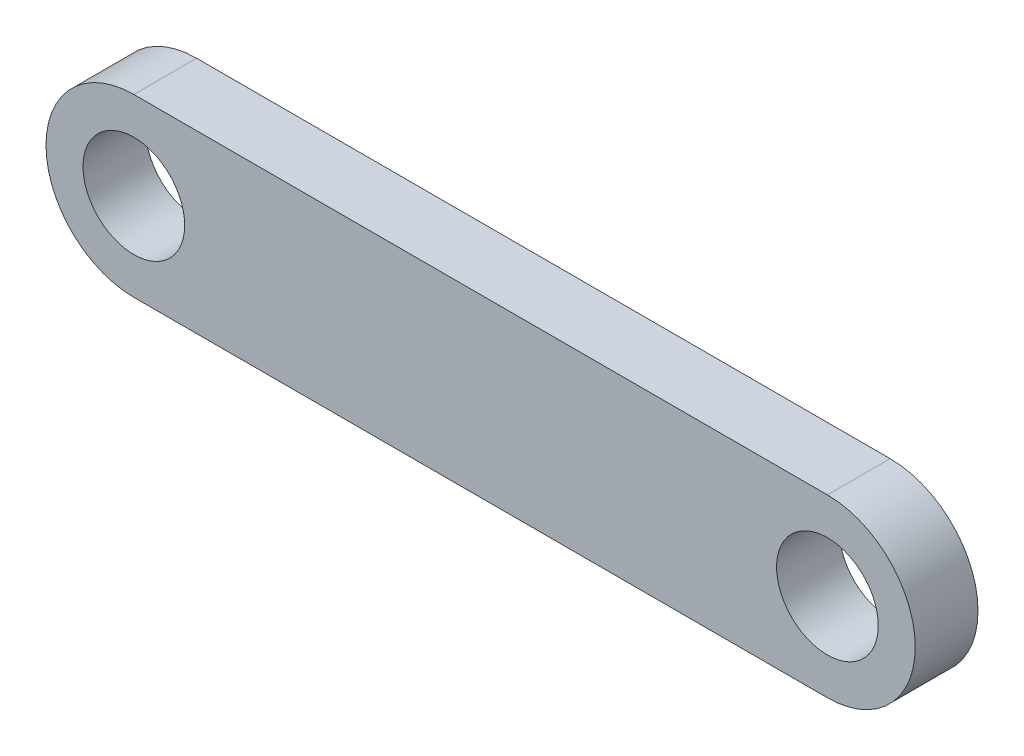
ISO-10303-21;
HEADER;
FILE_DESCRIPTION(('STEP AP214'),'2;1');
FILE_NAME('part.step','',(''),(''),'','','');
FILE_SCHEMA(('AUTOMOTIVE_DESIGN { 1 0 10303 214 1 1 1 1 }'));
ENDSEC;
DATA;
#1=APPLICATION_CONTEXT('core data for automotive mechanical design processes');
#2=APPLICATION_PROTOCOL_DEFINITION('international standard','automotive_design',2000,#1);
#3=PRODUCT_CONTEXT('',#1,'mechanical');
#4=PRODUCT('Part','Part','',(#3));
#5=PRODUCT_RELATED_PRODUCT_CATEGORY('part','',(#4));
#6=PRODUCT_DEFINITION_FORMATION('','',#4);
#7=PRODUCT_DEFINITION_CONTEXT('part definition',#1,'design');
#8=PRODUCT_DEFINITION('design','',#6,#7);
#9=PRODUCT_DEFINITION_SHAPE('','',#8);
#10=(LENGTH_UNIT() NAMED_UNIT(*) SI_UNIT(.MILLI.,.METRE.));
#11=(NAMED_UNIT(*) PLANE_ANGLE_UNIT() SI_UNIT($,.RADIAN.));
#12=(NAMED_UNIT(*) SI_UNIT($,.STERADIAN.) SOLID_ANGLE_UNIT());
#13=UNCERTAINTY_MEASURE_WITH_UNIT(LENGTH_MEASURE(1.E-05),#10,'distance_accuracy_value','');
#14=(GEOMETRIC_REPRESENTATION_CONTEXT(3) GLOBAL_UNCERTAINTY_ASSIGNED_CONTEXT((#13)) GLOBAL_UNIT_ASSIGNED_CONTEXT((#10,
#11,#12)) REPRESENTATION_CONTEXT('',''));
#15=CARTESIAN_POINT('',(0.,0.,0.));
#16=DIRECTION('',(0.,0.,1.));
#17=DIRECTION('',(1.,0.,0.));
#18=AXIS2_PLACEMENT_3D('',#15,#16,#17);
#19=CARTESIAN_POINT('',(0.,-7.,5.));
#20=DIRECTION('',(0.,1.,0.));
#21=DIRECTION('',(0.,0.,1.));
#22=AXIS2_PLACEMENT_3D('',#19,#20,#21);
#23=PLANE('',#22);
#24=DIRECTION('',(1.,0.,0.));
#25=VECTOR('',#24,1.);
#26=CARTESIAN_POINT('',(0.,-7.,0.));
#27=LINE('',#26,#25);
#28=CARTESIAN_POINT('',(0.,-7.,0.));
#29=VERTEX_POINT('',#28);
#30=CARTESIAN_POINT('',(55.26,-7.,0.));
#31=VERTEX_POINT('',#30);
#32=EDGE_CURVE('E106',#29,#31,#27,.T.);
#33=ORIENTED_EDGE('',*,*,#32,.T.);
#34=DIRECTION('',(0.,0.,-1.));
#35=VECTOR('',#34,1.);
#36=CARTESIAN_POINT('',(55.26,-7.,5.));
#37=LINE('',#36,#35);
#38=CARTESIAN_POINT('',(55.26,-7.,5.));
#39=VERTEX_POINT('',#38);
#40=EDGE_CURVE('E11',#39,#31,#37,.T.);
#41=ORIENTED_EDGE('',*,*,#40,.F.);
#42=DIRECTION('',(1.,0.,0.));
#43=VECTOR('',#42,1.);
#44=CARTESIAN_POINT('',(0.,-7.,5.));
#45=LINE('',#44,#43);
#46=CARTESIAN_POINT('',(0.,-7.,5.));
#47=VERTEX_POINT('',#46);
#48=EDGE_CURVE('E85',#47,#39,#45,.T.);
#49=ORIENTED_EDGE('',*,*,#48,.F.);
#50=DIRECTION('',(0.,0.,-1.));
#51=VECTOR('',#50,1.);
#52=CARTESIAN_POINT('',(0.,-7.,5.));
#53=LINE('',#52,#51);
#54=EDGE_CURVE('E102',#47,#29,#53,.T.);
#55=ORIENTED_EDGE('',*,*,#54,.T.);
#56=EDGE_LOOP('',(#33,#41,#49,#55));
#57=FACE_BOUND('',#56,.T.);
#58=ADVANCED_FACE('F36',(#57),#23,.F.);
#59=CARTESIAN_POINT('',(55.26,0.,5.));
#60=DIRECTION('',(0.,0.,-1.));
#61=DIRECTION('',(-1.,0.,0.));
#62=AXIS2_PLACEMENT_3D('',#59,#60,#61);
#63=CYLINDRICAL_SURFACE('',#62,7.);
#64=CARTESIAN_POINT('',(55.26,0.,0.));
#65=DIRECTION('',(0.,0.,1.));
#66=DIRECTION('',(1.,0.,0.));
#67=AXIS2_PLACEMENT_3D('',#64,#65,#66);
#68=CIRCLE('',#67,7.);
#69=CARTESIAN_POINT('',(55.26,7.,0.));
#70=VERTEX_POINT('',#69);
#71=EDGE_CURVE('E90',#31,#70,#68,.T.);
#72=ORIENTED_EDGE('',*,*,#71,.T.);
#73=DIRECTION('',(0.,0.,-1.));
#74=VECTOR('',#73,1.);
#75=CARTESIAN_POINT('',(55.26,7.,5.));
#76=LINE('',#75,#74);
#77=CARTESIAN_POINT('',(55.26,7.,5.));
#78=VERTEX_POINT('',#77);
#79=EDGE_CURVE('E45',#78,#70,#76,.T.);
#80=ORIENTED_EDGE('',*,*,#79,.F.);
#81=CARTESIAN_POINT('',(55.26,0.,5.));
#82=DIRECTION('',(0.,0.,1.));
#83=DIRECTION('',(1.,0.,0.));
#84=AXIS2_PLACEMENT_3D('',#81,#82,#83);
#85=CIRCLE('',#84,7.);
#86=EDGE_CURVE('E79',#39,#78,#85,.T.);
#87=ORIENTED_EDGE('',*,*,#86,.F.);
#88=ORIENTED_EDGE('',*,*,#40,.T.);
#89=EDGE_LOOP('',(#72,#80,#87,#88));
#90=FACE_BOUND('',#89,.T.);
#91=ADVANCED_FACE('F89',(#90),#63,.T.);
#92=CARTESIAN_POINT('',(0.,7.,5.));
#93=DIRECTION('',(0.,1.,0.));
#94=DIRECTION('',(0.,0.,1.));
#95=AXIS2_PLACEMENT_3D('',#92,#93,#94);
#96=PLANE('',#95);
#97=DIRECTION('',(1.,0.,0.));
#98=VECTOR('',#97,1.);
#99=CARTESIAN_POINT('',(0.,7.,0.));
#100=LINE('',#99,#98);
#101=CARTESIAN_POINT('',(0.,7.,0.));
#102=VERTEX_POINT('',#101);
#103=EDGE_CURVE('E110',#102,#70,#100,.T.);
#104=ORIENTED_EDGE('',*,*,#103,.F.);
#105=DIRECTION('',(0.,0.,-1.));
#106=VECTOR('',#105,1.);
#107=CARTESIAN_POINT('',(0.,7.,5.));
#108=LINE('',#107,#106);
#109=CARTESIAN_POINT('',(0.,7.,5.));
#110=VERTEX_POINT('',#109);
#111=EDGE_CURVE('E69',#110,#102,#108,.T.);
#112=ORIENTED_EDGE('',*,*,#111,.F.);
#113=DIRECTION('',(1.,0.,0.));
#114=VECTOR('',#113,1.);
#115=CARTESIAN_POINT('',(0.,7.,5.));
#116=LINE('',#115,#114);
#117=EDGE_CURVE('E83',#110,#78,#116,.T.);
#118=ORIENTED_EDGE('',*,*,#117,.T.);
#119=ORIENTED_EDGE('',*,*,#79,.T.);
#120=EDGE_LOOP('',(#104,#112,#118,#119));
#121=FACE_BOUND('',#120,.T.);
#122=ADVANCED_FACE('F94',(#121),#96,.T.);
#123=CARTESIAN_POINT('',(0.,0.,5.));
#124=DIRECTION('',(0.,0.,-1.));
#125=DIRECTION('',(-1.,0.,0.));
#126=AXIS2_PLACEMENT_3D('',#123,#124,#125);
#127=CYLINDRICAL_SURFACE('',#126,7.);
#128=CARTESIAN_POINT('',(0.,0.,0.));
#129=DIRECTION('',(0.,0.,1.));
#130=DIRECTION('',(1.,0.,0.));
#131=AXIS2_PLACEMENT_3D('',#128,#129,#130);
#132=CIRCLE('',#131,7.);
#133=EDGE_CURVE('E72',#102,#29,#132,.T.);
#134=ORIENTED_EDGE('',*,*,#133,.T.);
#135=ORIENTED_EDGE('',*,*,#54,.F.);
#136=CARTESIAN_POINT('',(0.,0.,5.));
#137=DIRECTION('',(0.,0.,1.));
#138=DIRECTION('',(1.,0.,0.));
#139=AXIS2_PLACEMENT_3D('',#136,#137,#138);
#140=CIRCLE('',#139,7.);
#141=EDGE_CURVE('E53',#110,#47,#140,.T.);
#142=ORIENTED_EDGE('',*,*,#141,.F.);
#143=ORIENTED_EDGE('',*,*,#111,.T.);
#144=EDGE_LOOP('',(#134,#135,#142,#143));
#145=FACE_BOUND('',#144,.T.);
#146=ADVANCED_FACE('F138',(#145),#127,.T.);
#147=CARTESIAN_POINT('',(0.,0.,5.));
#148=DIRECTION('',(0.,0.,-1.));
#149=DIRECTION('',(-1.,0.,0.));
#150=AXIS2_PLACEMENT_3D('',#147,#148,#149);
#151=CYLINDRICAL_SURFACE('',#150,4.05);
#152=CARTESIAN_POINT('',(0.,0.,5.));
#153=DIRECTION('',(0.,0.,1.));
#154=DIRECTION('',(1.,0.,0.));
#155=AXIS2_PLACEMENT_3D('',#152,#153,#154);
#156=CIRCLE('',#155,4.05);
#157=CARTESIAN_POINT('',(4.05,0.,5.));
#158=VERTEX_POINT('',#157);
#159=EDGE_CURVE('E116',#158,#158,#156,.T.);
#160=ORIENTED_EDGE('',*,*,#159,.T.);
#161=EDGE_LOOP('',(#160));
#162=FACE_BOUND('',#161,.T.);
#163=CARTESIAN_POINT('',(0.,0.,0.));
#164=DIRECTION('',(0.,0.,1.));
#165=DIRECTION('',(1.,0.,0.));
#166=AXIS2_PLACEMENT_3D('',#163,#164,#165);
#167=CIRCLE('',#166,4.05);
#168=CARTESIAN_POINT('',(4.05,0.,0.));
#169=VERTEX_POINT('',#168);
#170=EDGE_CURVE('E103',#169,#169,#167,.T.);
#171=ORIENTED_EDGE('',*,*,#170,.F.);
#172=EDGE_LOOP('',(#171));
#173=FACE_BOUND('',#172,.T.);
#174=ADVANCED_FACE('F38',(#162,#173),#151,.F.);
#175=CARTESIAN_POINT('',(55.26,0.,5.));
#176=DIRECTION('',(0.,0.,-1.));
#177=DIRECTION('',(-1.,0.,0.));
#178=AXIS2_PLACEMENT_3D('',#175,#176,#177);
#179=CYLINDRICAL_SURFACE('',#178,4.05);
#180=CARTESIAN_POINT('',(55.26,0.,5.));
#181=DIRECTION('',(0.,0.,1.));
#182=DIRECTION('',(1.,0.,0.));
#183=AXIS2_PLACEMENT_3D('',#180,#181,#182);
#184=CIRCLE('',#183,4.05);
#185=CARTESIAN_POINT('',(59.31,0.,5.));
#186=VERTEX_POINT('',#185);
#187=EDGE_CURVE('E96',#186,#186,#184,.T.);
#188=ORIENTED_EDGE('',*,*,#187,.T.);
#189=EDGE_LOOP('',(#188));
#190=FACE_BOUND('',#189,.T.);
#191=CARTESIAN_POINT('',(55.26,0.,0.));
#192=DIRECTION('',(0.,0.,1.));
#193=DIRECTION('',(1.,0.,0.));
#194=AXIS2_PLACEMENT_3D('',#191,#192,#193);
#195=CIRCLE('',#194,4.05);
#196=CARTESIAN_POINT('',(59.31,0.,0.));
#197=VERTEX_POINT('',#196);
#198=EDGE_CURVE('E113',#197,#197,#195,.T.);
#199=ORIENTED_EDGE('',*,*,#198,.F.);
#200=EDGE_LOOP('',(#199));
#201=FACE_BOUND('',#200,.T.);
#202=ADVANCED_FACE('F128',(#190,#201),#179,.F.);
#203=CARTESIAN_POINT('',(0.,0.,5.));
#204=DIRECTION('',(0.,0.,1.));
#205=DIRECTION('',(1.,0.,0.));
#206=AXIS2_PLACEMENT_3D('',#203,#204,#205);
#207=PLANE('',#206);
#208=ORIENTED_EDGE('',*,*,#159,.F.);
#209=EDGE_LOOP('',(#208));
#210=FACE_BOUND('',#209,.T.);
#211=ORIENTED_EDGE('',*,*,#48,.T.);
#212=ORIENTED_EDGE('',*,*,#86,.T.);
#213=ORIENTED_EDGE('',*,*,#117,.F.);
#214=ORIENTED_EDGE('',*,*,#141,.T.);
#215=EDGE_LOOP('',(#211,#212,#213,#214));
#216=FACE_BOUND('',#215,.T.);
#217=ORIENTED_EDGE('',*,*,#187,.F.);
#218=EDGE_LOOP('',(#217));
#219=FACE_BOUND('',#218,.T.);
#220=ADVANCED_FACE('F80',(#210,#216,#219),#207,.T.);
#221=CARTESIAN_POINT('',(0.,0.,0.));
#222=DIRECTION('',(0.,0.,1.));
#223=DIRECTION('',(1.,0.,0.));
#224=AXIS2_PLACEMENT_3D('',#221,#222,#223);
#225=PLANE('',#224);
#226=ORIENTED_EDGE('',*,*,#170,.T.);
#227=EDGE_LOOP('',(#226));
#228=FACE_BOUND('',#227,.T.);
#229=ORIENTED_EDGE('',*,*,#32,.F.);
#230=ORIENTED_EDGE('',*,*,#133,.F.);
#231=ORIENTED_EDGE('',*,*,#103,.T.);
#232=ORIENTED_EDGE('',*,*,#71,.F.);
#233=EDGE_LOOP('',(#229,#230,#231,#232));
#234=FACE_BOUND('',#233,.T.);
#235=ORIENTED_EDGE('',*,*,#198,.T.);
#236=EDGE_LOOP('',(#235));
#237=FACE_BOUND('',#236,.T.);
#238=ADVANCED_FACE('F121',(#228,#234,#237),#225,.F.);
#239=CLOSED_SHELL('',(#58,#91,#122,#146,#174,#202,#220,#238));
#240=MANIFOLD_SOLID_BREP('B2',#239);
#241=ADVANCED_BREP_SHAPE_REPRESENTATION('',(#18,#240),#14);
#242=SHAPE_DEFINITION_REPRESENTATION(#9,#241);
ENDSEC;
END-ISO-10303-21;
